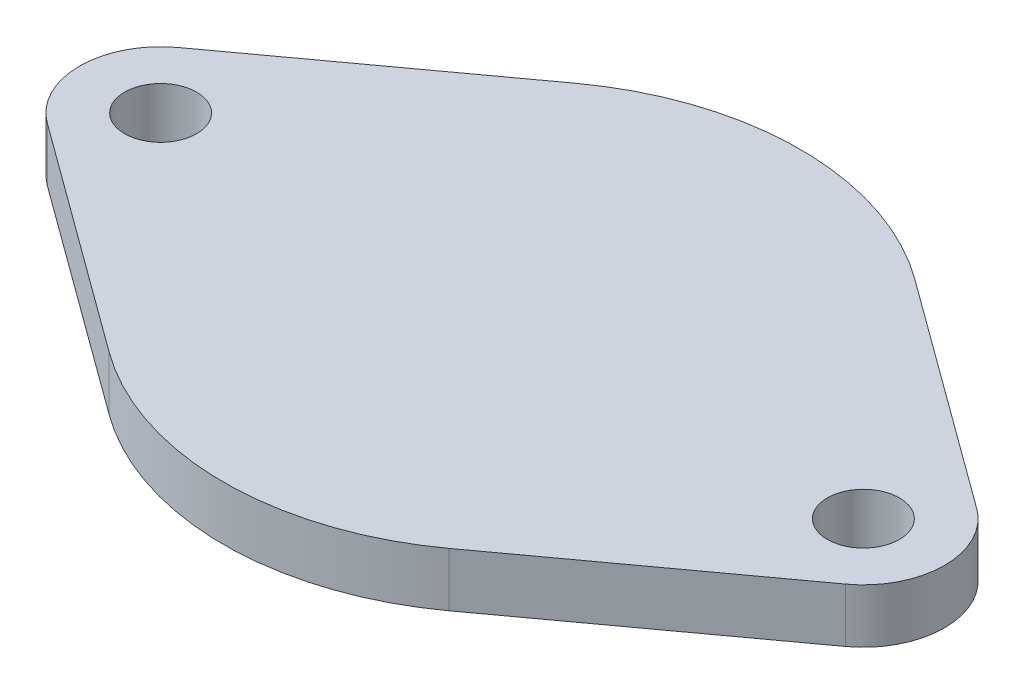
ISO-10303-21;
HEADER;
FILE_DESCRIPTION(('STEP AP214'),'2;1');
FILE_NAME('part.step','',(''),(''),'','','');
FILE_SCHEMA(('AUTOMOTIVE_DESIGN { 1 0 10303 214 1 1 1 1 }'));
ENDSEC;
DATA;
#1=APPLICATION_CONTEXT('core data for automotive mechanical design processes');
#2=APPLICATION_PROTOCOL_DEFINITION('international standard','automotive_design',2000,#1);
#3=PRODUCT_CONTEXT('',#1,'mechanical');
#4=PRODUCT('Part','Part','',(#3));
#5=PRODUCT_RELATED_PRODUCT_CATEGORY('part','',(#4));
#6=PRODUCT_DEFINITION_FORMATION('','',#4);
#7=PRODUCT_DEFINITION_CONTEXT('part definition',#1,'design');
#8=PRODUCT_DEFINITION('design','',#6,#7);
#9=PRODUCT_DEFINITION_SHAPE('','',#8);
#10=(LENGTH_UNIT() NAMED_UNIT(*) SI_UNIT(.MILLI.,.METRE.));
#11=(NAMED_UNIT(*) PLANE_ANGLE_UNIT() SI_UNIT($,.RADIAN.));
#12=(NAMED_UNIT(*) SI_UNIT($,.STERADIAN.) SOLID_ANGLE_UNIT());
#13=UNCERTAINTY_MEASURE_WITH_UNIT(LENGTH_MEASURE(1.E-05),#10,'distance_accuracy_value','');
#14=(GEOMETRIC_REPRESENTATION_CONTEXT(3) GLOBAL_UNCERTAINTY_ASSIGNED_CONTEXT((#13)) GLOBAL_UNIT_ASSIGNED_CONTEXT((#10,
#11,#12)) REPRESENTATION_CONTEXT('',''));
#15=CARTESIAN_POINT('',(0.,0.,0.));
#16=DIRECTION('',(0.,0.,1.));
#17=DIRECTION('',(1.,0.,0.));
#18=AXIS2_PLACEMENT_3D('',#15,#16,#17);
#19=CARTESIAN_POINT('',(19.5,3.,0.));
#20=DIRECTION('',(0.,1.,0.));
#21=DIRECTION('',(0.,0.,1.));
#22=AXIS2_PLACEMENT_3D('',#19,#20,#21);
#23=PLANE('',#22);
#24=CARTESIAN_POINT('',(-19.5,3.,0.));
#25=DIRECTION('',(0.,1.,0.));
#26=DIRECTION('',(0.,0.,1.));
#27=AXIS2_PLACEMENT_3D('',#24,#25,#26);
#28=CIRCLE('',#27,2.);
#29=CARTESIAN_POINT('',(-19.5,3.,2.));
#30=VERTEX_POINT('',#29);
#31=EDGE_CURVE('E136',#30,#30,#28,.T.);
#32=ORIENTED_EDGE('',*,*,#31,.F.);
#33=EDGE_LOOP('',(#32));
#34=FACE_BOUND('',#33,.T.);
#35=CARTESIAN_POINT('',(19.5,3.,0.));
#36=DIRECTION('',(0.,1.,0.));
#37=DIRECTION('',(0.,0.,1.));
#38=AXIS2_PLACEMENT_3D('',#35,#36,#37);
#39=CIRCLE('',#38,4.5);
#40=CARTESIAN_POINT('',(22.1538461538462,3.,3.63415748031314));
#41=VERTEX_POINT('',#40);
#42=CARTESIAN_POINT('',(22.1538461538462,3.,-3.63415748031314));
#43=VERTEX_POINT('',#42);
#44=EDGE_CURVE('E147',#41,#43,#39,.T.);
#45=ORIENTED_EDGE('',*,*,#44,.T.);
#46=DIRECTION('',(-0.807590551180698,0.,-0.58974358974359));
#47=VECTOR('',#46,1.);
#48=CARTESIAN_POINT('',(22.1538461538462,3.,-3.63415748031314));
#49=LINE('',#48,#47);
#50=CARTESIAN_POINT('',(9.43589743589744,3.,-12.9214488188912));
#51=VERTEX_POINT('',#50);
#52=EDGE_CURVE('E95',#43,#51,#49,.T.);
#53=ORIENTED_EDGE('',*,*,#52,.T.);
#54=CARTESIAN_POINT('',(0.,3.,0.));
#55=DIRECTION('',(0.,1.,0.));
#56=DIRECTION('',(0.,0.,1.));
#57=AXIS2_PLACEMENT_3D('',#54,#55,#56);
#58=CIRCLE('',#57,16.);
#59=CARTESIAN_POINT('',(-9.43589743589744,3.,-12.9214488188912));
#60=VERTEX_POINT('',#59);
#61=EDGE_CURVE('E162',#51,#60,#58,.T.);
#62=ORIENTED_EDGE('',*,*,#61,.T.);
#63=DIRECTION('',(-0.807590551180698,0.,0.58974358974359));
#64=VECTOR('',#63,1.);
#65=CARTESIAN_POINT('',(-22.1538461538462,3.,-3.63415748031314));
#66=LINE('',#65,#64);
#67=CARTESIAN_POINT('',(-22.1538461538462,3.,-3.63415748031314));
#68=VERTEX_POINT('',#67);
#69=EDGE_CURVE('E175',#60,#68,#66,.T.);
#70=ORIENTED_EDGE('',*,*,#69,.T.);
#71=CARTESIAN_POINT('',(-19.5,3.,0.));
#72=DIRECTION('',(0.,1.,0.));
#73=DIRECTION('',(0.,0.,1.));
#74=AXIS2_PLACEMENT_3D('',#71,#72,#73);
#75=CIRCLE('',#74,4.5);
#76=CARTESIAN_POINT('',(-22.1538461538462,3.,3.63415748031314));
#77=VERTEX_POINT('',#76);
#78=EDGE_CURVE('E114',#68,#77,#75,.T.);
#79=ORIENTED_EDGE('',*,*,#78,.T.);
#80=DIRECTION('',(0.807590551180698,0.,0.58974358974359));
#81=VECTOR('',#80,1.);
#82=CARTESIAN_POINT('',(-9.43589743589744,3.,12.9214488188912));
#83=LINE('',#82,#81);
#84=CARTESIAN_POINT('',(-9.43589743589744,3.,12.9214488188912));
#85=VERTEX_POINT('',#84);
#86=EDGE_CURVE('E108',#77,#85,#83,.T.);
#87=ORIENTED_EDGE('',*,*,#86,.T.);
#88=CARTESIAN_POINT('',(0.,3.,0.));
#89=DIRECTION('',(0.,1.,0.));
#90=DIRECTION('',(0.,0.,1.));
#91=AXIS2_PLACEMENT_3D('',#88,#89,#90);
#92=CIRCLE('',#91,16.);
#93=CARTESIAN_POINT('',(9.43589743589745,3.,12.9214488188912));
#94=VERTEX_POINT('',#93);
#95=EDGE_CURVE('E112',#85,#94,#92,.T.);
#96=ORIENTED_EDGE('',*,*,#95,.T.);
#97=DIRECTION('',(0.807590551180698,0.,-0.58974358974359));
#98=VECTOR('',#97,1.);
#99=CARTESIAN_POINT('',(22.1538461538462,3.,3.63415748031314));
#100=LINE('',#99,#98);
#101=EDGE_CURVE('E52',#94,#41,#100,.T.);
#102=ORIENTED_EDGE('',*,*,#101,.T.);
#103=EDGE_LOOP('',(#45,#53,#62,#70,#79,#87,#96,#102));
#104=FACE_BOUND('',#103,.T.);
#105=CARTESIAN_POINT('',(19.5,3.,0.));
#106=DIRECTION('',(0.,1.,0.));
#107=DIRECTION('',(0.,0.,1.));
#108=AXIS2_PLACEMENT_3D('',#105,#106,#107);
#109=CIRCLE('',#108,2.);
#110=CARTESIAN_POINT('',(19.5,3.,2.));
#111=VERTEX_POINT('',#110);
#112=EDGE_CURVE('E184',#111,#111,#109,.T.);
#113=ORIENTED_EDGE('',*,*,#112,.F.);
#114=EDGE_LOOP('',(#113));
#115=FACE_BOUND('',#114,.T.);
#116=ADVANCED_FACE('F35',(#34,#104,#115),#23,.T.);
#117=CARTESIAN_POINT('',(19.5,0.,0.));
#118=DIRECTION('',(0.,1.,0.));
#119=DIRECTION('',(0.,0.,1.));
#120=AXIS2_PLACEMENT_3D('',#117,#118,#119);
#121=PLANE('',#120);
#122=CARTESIAN_POINT('',(19.5,0.,0.));
#123=DIRECTION('',(0.,1.,0.));
#124=DIRECTION('',(0.,0.,1.));
#125=AXIS2_PLACEMENT_3D('',#122,#123,#124);
#126=CIRCLE('',#125,4.5);
#127=CARTESIAN_POINT('',(22.1538461538462,0.,3.63415748031314));
#128=VERTEX_POINT('',#127);
#129=CARTESIAN_POINT('',(22.1538461538462,0.,-3.63415748031314));
#130=VERTEX_POINT('',#129);
#131=EDGE_CURVE('E132',#128,#130,#126,.T.);
#132=ORIENTED_EDGE('',*,*,#131,.F.);
#133=DIRECTION('',(0.807590551180698,0.,-0.58974358974359));
#134=VECTOR('',#133,1.);
#135=CARTESIAN_POINT('',(22.1538461538462,0.,3.63415748031314));
#136=LINE('',#135,#134);
#137=CARTESIAN_POINT('',(9.43589743589745,0.,12.9214488188912));
#138=VERTEX_POINT('',#137);
#139=EDGE_CURVE('E87',#138,#128,#136,.T.);
#140=ORIENTED_EDGE('',*,*,#139,.F.);
#141=CARTESIAN_POINT('',(0.,0.,0.));
#142=DIRECTION('',(0.,1.,0.));
#143=DIRECTION('',(0.,0.,1.));
#144=AXIS2_PLACEMENT_3D('',#141,#142,#143);
#145=CIRCLE('',#144,16.);
#146=CARTESIAN_POINT('',(-9.43589743589744,0.,12.9214488188912));
#147=VERTEX_POINT('',#146);
#148=EDGE_CURVE('E81',#147,#138,#145,.T.);
#149=ORIENTED_EDGE('',*,*,#148,.F.);
#150=DIRECTION('',(0.807590551180698,0.,0.58974358974359));
#151=VECTOR('',#150,1.);
#152=CARTESIAN_POINT('',(-9.43589743589744,0.,12.9214488188912));
#153=LINE('',#152,#151);
#154=CARTESIAN_POINT('',(-22.1538461538462,0.,3.63415748031314));
#155=VERTEX_POINT('',#154);
#156=EDGE_CURVE('E122',#155,#147,#153,.T.);
#157=ORIENTED_EDGE('',*,*,#156,.F.);
#158=CARTESIAN_POINT('',(-19.5,0.,0.));
#159=DIRECTION('',(0.,1.,0.));
#160=DIRECTION('',(0.,0.,1.));
#161=AXIS2_PLACEMENT_3D('',#158,#159,#160);
#162=CIRCLE('',#161,4.5);
#163=CARTESIAN_POINT('',(-22.1538461538462,0.,-3.63415748031314));
#164=VERTEX_POINT('',#163);
#165=EDGE_CURVE('E142',#164,#155,#162,.T.);
#166=ORIENTED_EDGE('',*,*,#165,.F.);
#167=DIRECTION('',(-0.807590551180698,0.,0.58974358974359));
#168=VECTOR('',#167,1.);
#169=CARTESIAN_POINT('',(-22.1538461538462,0.,-3.63415748031314));
#170=LINE('',#169,#168);
#171=CARTESIAN_POINT('',(-9.43589743589744,0.,-12.9214488188912));
#172=VERTEX_POINT('',#171);
#173=EDGE_CURVE('E140',#172,#164,#170,.T.);
#174=ORIENTED_EDGE('',*,*,#173,.F.);
#175=CARTESIAN_POINT('',(0.,0.,0.));
#176=DIRECTION('',(0.,1.,0.));
#177=DIRECTION('',(0.,0.,1.));
#178=AXIS2_PLACEMENT_3D('',#175,#176,#177);
#179=CIRCLE('',#178,16.);
#180=CARTESIAN_POINT('',(9.43589743589744,0.,-12.9214488188912));
#181=VERTEX_POINT('',#180);
#182=EDGE_CURVE('E138',#181,#172,#179,.T.);
#183=ORIENTED_EDGE('',*,*,#182,.F.);
#184=DIRECTION('',(-0.807590551180698,0.,-0.58974358974359));
#185=VECTOR('',#184,1.);
#186=CARTESIAN_POINT('',(22.1538461538462,0.,-3.63415748031314));
#187=LINE('',#186,#185);
#188=EDGE_CURVE('E135',#130,#181,#187,.T.);
#189=ORIENTED_EDGE('',*,*,#188,.F.);
#190=EDGE_LOOP('',(#132,#140,#149,#157,#166,#174,#183,#189));
#191=FACE_BOUND('',#190,.T.);
#192=CARTESIAN_POINT('',(-19.5,0.,0.));
#193=DIRECTION('',(0.,1.,0.));
#194=DIRECTION('',(0.,0.,1.));
#195=AXIS2_PLACEMENT_3D('',#192,#193,#194);
#196=CIRCLE('',#195,2.);
#197=CARTESIAN_POINT('',(-19.5,0.,2.));
#198=VERTEX_POINT('',#197);
#199=EDGE_CURVE('E181',#198,#198,#196,.T.);
#200=ORIENTED_EDGE('',*,*,#199,.T.);
#201=EDGE_LOOP('',(#200));
#202=FACE_BOUND('',#201,.T.);
#203=CARTESIAN_POINT('',(19.5,0.,0.));
#204=DIRECTION('',(0.,1.,0.));
#205=DIRECTION('',(0.,0.,1.));
#206=AXIS2_PLACEMENT_3D('',#203,#204,#205);
#207=CIRCLE('',#206,2.);
#208=CARTESIAN_POINT('',(19.5,0.,2.));
#209=VERTEX_POINT('',#208);
#210=EDGE_CURVE('E187',#209,#209,#207,.T.);
#211=ORIENTED_EDGE('',*,*,#210,.T.);
#212=EDGE_LOOP('',(#211));
#213=FACE_BOUND('',#212,.T.);
#214=ADVANCED_FACE('F166',(#191,#202,#213),#121,.F.);
#215=CARTESIAN_POINT('',(19.5,3.,0.));
#216=DIRECTION('',(0.,-1.,0.));
#217=DIRECTION('',(0.,0.,-1.));
#218=AXIS2_PLACEMENT_3D('',#215,#216,#217);
#219=CYLINDRICAL_SURFACE('',#218,4.5);
#220=ORIENTED_EDGE('',*,*,#131,.T.);
#221=DIRECTION('',(0.,-1.,0.));
#222=VECTOR('',#221,1.);
#223=CARTESIAN_POINT('',(22.1538461538462,3.,-3.63415748031314));
#224=LINE('',#223,#222);
#225=EDGE_CURVE('E11',#43,#130,#224,.T.);
#226=ORIENTED_EDGE('',*,*,#225,.F.);
#227=ORIENTED_EDGE('',*,*,#44,.F.);
#228=DIRECTION('',(0.,-1.,0.));
#229=VECTOR('',#228,1.);
#230=CARTESIAN_POINT('',(22.1538461538462,3.,3.63415748031314));
#231=LINE('',#230,#229);
#232=EDGE_CURVE('E128',#41,#128,#231,.T.);
#233=ORIENTED_EDGE('',*,*,#232,.T.);
#234=EDGE_LOOP('',(#220,#226,#227,#233));
#235=FACE_BOUND('',#234,.T.);
#236=ADVANCED_FACE('F37',(#235),#219,.T.);
#237=CARTESIAN_POINT('',(22.1538461538462,3.,-3.63415748031314));
#238=DIRECTION('',(-0.58974358974359,0.,0.807590551180698));
#239=DIRECTION('',(0.807590551180699,0.,0.58974358974359));
#240=AXIS2_PLACEMENT_3D('',#237,#238,#239);
#241=PLANE('',#240);
#242=ORIENTED_EDGE('',*,*,#188,.T.);
#243=DIRECTION('',(0.,-1.,0.));
#244=VECTOR('',#243,1.);
#245=CARTESIAN_POINT('',(9.43589743589744,3.,-12.9214488188912));
#246=LINE('',#245,#244);
#247=EDGE_CURVE('E44',#51,#181,#246,.T.);
#248=ORIENTED_EDGE('',*,*,#247,.F.);
#249=ORIENTED_EDGE('',*,*,#52,.F.);
#250=ORIENTED_EDGE('',*,*,#225,.T.);
#251=EDGE_LOOP('',(#242,#248,#249,#250));
#252=FACE_BOUND('',#251,.T.);
#253=ADVANCED_FACE('F219',(#252),#241,.F.);
#254=CARTESIAN_POINT('',(0.,3.,0.));
#255=DIRECTION('',(0.,-1.,0.));
#256=DIRECTION('',(0.,0.,-1.));
#257=AXIS2_PLACEMENT_3D('',#254,#255,#256);
#258=CYLINDRICAL_SURFACE('',#257,16.);
#259=ORIENTED_EDGE('',*,*,#182,.T.);
#260=DIRECTION('',(0.,-1.,0.));
#261=VECTOR('',#260,1.);
#262=CARTESIAN_POINT('',(-9.43589743589744,3.,-12.9214488188912));
#263=LINE('',#262,#261);
#264=EDGE_CURVE('E154',#60,#172,#263,.T.);
#265=ORIENTED_EDGE('',*,*,#264,.F.);
#266=ORIENTED_EDGE('',*,*,#61,.F.);
#267=ORIENTED_EDGE('',*,*,#247,.T.);
#268=EDGE_LOOP('',(#259,#265,#266,#267));
#269=FACE_BOUND('',#268,.T.);
#270=ADVANCED_FACE('F160',(#269),#258,.T.);
#271=CARTESIAN_POINT('',(-22.1538461538462,3.,-3.63415748031314));
#272=DIRECTION('',(0.58974358974359,0.,0.807590551180698));
#273=DIRECTION('',(0.807590551180698,0.,-0.58974358974359));
#274=AXIS2_PLACEMENT_3D('',#271,#272,#273);
#275=PLANE('',#274);
#276=ORIENTED_EDGE('',*,*,#173,.T.);
#277=DIRECTION('',(0.,-1.,0.));
#278=VECTOR('',#277,1.);
#279=CARTESIAN_POINT('',(-22.1538461538462,3.,-3.63415748031314));
#280=LINE('',#279,#278);
#281=EDGE_CURVE('E151',#68,#164,#280,.T.);
#282=ORIENTED_EDGE('',*,*,#281,.F.);
#283=ORIENTED_EDGE('',*,*,#69,.F.);
#284=ORIENTED_EDGE('',*,*,#264,.T.);
#285=EDGE_LOOP('',(#276,#282,#283,#284));
#286=FACE_BOUND('',#285,.T.);
#287=ADVANCED_FACE('F171',(#286),#275,.F.);
#288=CARTESIAN_POINT('',(-19.5,3.,0.));
#289=DIRECTION('',(0.,-1.,0.));
#290=DIRECTION('',(0.,0.,-1.));
#291=AXIS2_PLACEMENT_3D('',#288,#289,#290);
#292=CYLINDRICAL_SURFACE('',#291,4.5);
#293=ORIENTED_EDGE('',*,*,#165,.T.);
#294=DIRECTION('',(0.,-1.,0.));
#295=VECTOR('',#294,1.);
#296=CARTESIAN_POINT('',(-22.1538461538462,3.,3.63415748031314));
#297=LINE('',#296,#295);
#298=EDGE_CURVE('E123',#77,#155,#297,.T.);
#299=ORIENTED_EDGE('',*,*,#298,.F.);
#300=ORIENTED_EDGE('',*,*,#78,.F.);
#301=ORIENTED_EDGE('',*,*,#281,.T.);
#302=EDGE_LOOP('',(#293,#299,#300,#301));
#303=FACE_BOUND('',#302,.T.);
#304=ADVANCED_FACE('F174',(#303),#292,.T.);
#305=CARTESIAN_POINT('',(-9.43589743589744,3.,12.9214488188912));
#306=DIRECTION('',(0.58974358974359,0.,-0.807590551180698));
#307=DIRECTION('',(-0.807590551180698,0.,-0.58974358974359));
#308=AXIS2_PLACEMENT_3D('',#305,#306,#307);
#309=PLANE('',#308);
#310=ORIENTED_EDGE('',*,*,#156,.T.);
#311=DIRECTION('',(0.,-1.,0.));
#312=VECTOR('',#311,1.);
#313=CARTESIAN_POINT('',(-9.43589743589744,3.,12.9214488188912));
#314=LINE('',#313,#312);
#315=EDGE_CURVE('E119',#85,#147,#314,.T.);
#316=ORIENTED_EDGE('',*,*,#315,.F.);
#317=ORIENTED_EDGE('',*,*,#86,.F.);
#318=ORIENTED_EDGE('',*,*,#298,.T.);
#319=EDGE_LOOP('',(#310,#316,#317,#318));
#320=FACE_BOUND('',#319,.T.);
#321=ADVANCED_FACE('F120',(#320),#309,.F.);
#322=CARTESIAN_POINT('',(0.,3.,0.));
#323=DIRECTION('',(0.,-1.,0.));
#324=DIRECTION('',(0.,0.,-1.));
#325=AXIS2_PLACEMENT_3D('',#322,#323,#324);
#326=CYLINDRICAL_SURFACE('',#325,16.);
#327=ORIENTED_EDGE('',*,*,#148,.T.);
#328=DIRECTION('',(0.,-1.,0.));
#329=VECTOR('',#328,1.);
#330=CARTESIAN_POINT('',(9.43589743589745,3.,12.9214488188912));
#331=LINE('',#330,#329);
#332=EDGE_CURVE('E124',#94,#138,#331,.T.);
#333=ORIENTED_EDGE('',*,*,#332,.F.);
#334=ORIENTED_EDGE('',*,*,#95,.F.);
#335=ORIENTED_EDGE('',*,*,#315,.T.);
#336=EDGE_LOOP('',(#327,#333,#334,#335));
#337=FACE_BOUND('',#336,.T.);
#338=ADVANCED_FACE('F126',(#337),#326,.T.);
#339=CARTESIAN_POINT('',(22.1538461538462,3.,3.63415748031314));
#340=DIRECTION('',(-0.58974358974359,0.,-0.807590551180698));
#341=DIRECTION('',(-0.807590551180699,0.,0.58974358974359));
#342=AXIS2_PLACEMENT_3D('',#339,#340,#341);
#343=PLANE('',#342);
#344=ORIENTED_EDGE('',*,*,#139,.T.);
#345=ORIENTED_EDGE('',*,*,#232,.F.);
#346=ORIENTED_EDGE('',*,*,#101,.F.);
#347=ORIENTED_EDGE('',*,*,#332,.T.);
#348=EDGE_LOOP('',(#344,#345,#346,#347));
#349=FACE_BOUND('',#348,.T.);
#350=ADVANCED_FACE('F207',(#349),#343,.F.);
#351=CARTESIAN_POINT('',(-19.5,3.,0.));
#352=DIRECTION('',(0.,-1.,0.));
#353=DIRECTION('',(0.,0.,-1.));
#354=AXIS2_PLACEMENT_3D('',#351,#352,#353);
#355=CYLINDRICAL_SURFACE('',#354,2.);
#356=ORIENTED_EDGE('',*,*,#31,.T.);
#357=EDGE_LOOP('',(#356));
#358=FACE_BOUND('',#357,.T.);
#359=ORIENTED_EDGE('',*,*,#199,.F.);
#360=EDGE_LOOP('',(#359));
#361=FACE_BOUND('',#360,.T.);
#362=ADVANCED_FACE('F204',(#358,#361),#355,.F.);
#363=CARTESIAN_POINT('',(19.5,3.,0.));
#364=DIRECTION('',(0.,-1.,0.));
#365=DIRECTION('',(0.,0.,-1.));
#366=AXIS2_PLACEMENT_3D('',#363,#364,#365);
#367=CYLINDRICAL_SURFACE('',#366,2.);
#368=ORIENTED_EDGE('',*,*,#112,.T.);
#369=EDGE_LOOP('',(#368));
#370=FACE_BOUND('',#369,.T.);
#371=ORIENTED_EDGE('',*,*,#210,.F.);
#372=EDGE_LOOP('',(#371));
#373=FACE_BOUND('',#372,.T.);
#374=ADVANCED_FACE('F193',(#370,#373),#367,.F.);
#375=CLOSED_SHELL('',(#116,#214,#236,#253,#270,#287,#304,#321,#338,#350,#362,#374));
#376=MANIFOLD_SOLID_BREP('B2',#375);
#377=ADVANCED_BREP_SHAPE_REPRESENTATION('',(#18,#376),#14);
#378=SHAPE_DEFINITION_REPRESENTATION(#9,#377);
ENDSEC;
END-ISO-10303-21;
